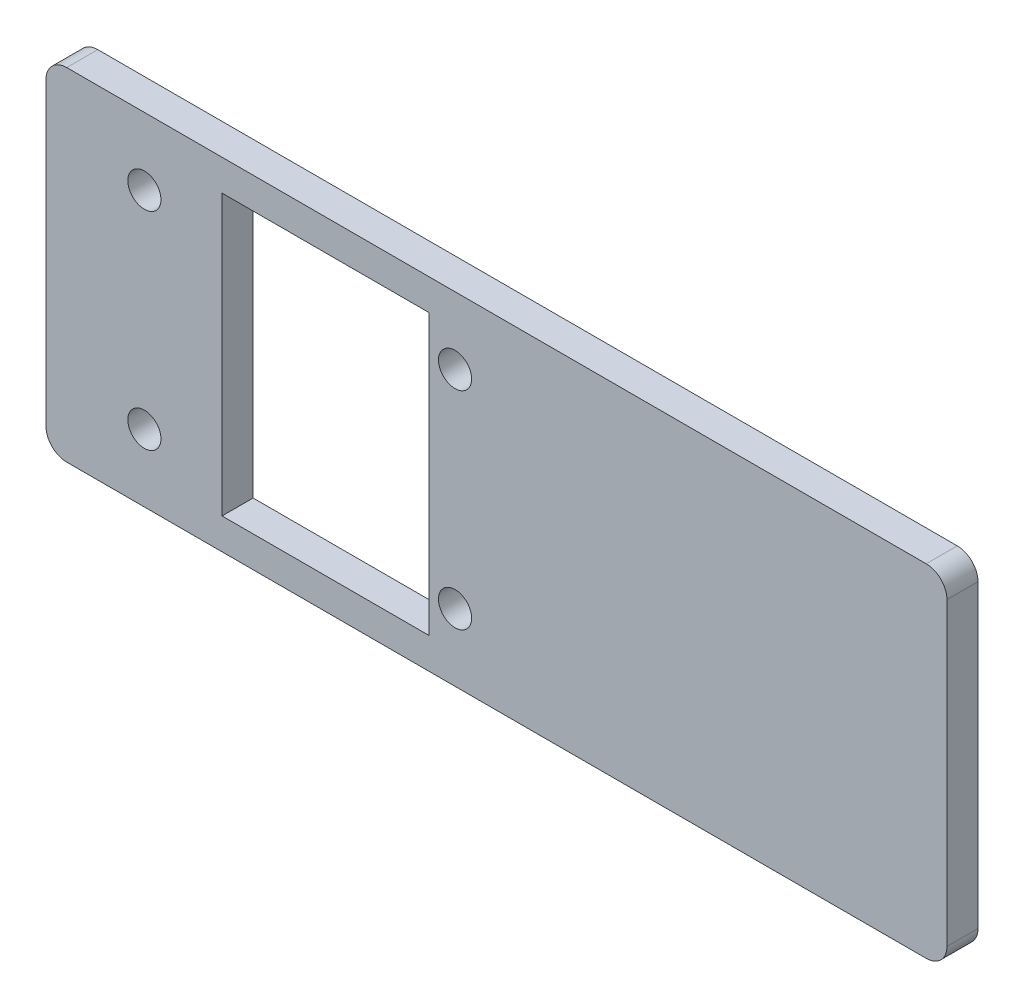
ISO-10303-21;
HEADER;
FILE_DESCRIPTION(('STEP AP214'),'2;1');
FILE_NAME('part.step','',(''),(''),'','','');
FILE_SCHEMA(('AUTOMOTIVE_DESIGN { 1 0 10303 214 1 1 1 1 }'));
ENDSEC;
DATA;
#1=APPLICATION_CONTEXT('core data for automotive mechanical design processes');
#2=APPLICATION_PROTOCOL_DEFINITION('international standard','automotive_design',2000,#1);
#3=PRODUCT_CONTEXT('',#1,'mechanical');
#4=PRODUCT('Part','Part','',(#3));
#5=PRODUCT_RELATED_PRODUCT_CATEGORY('part','',(#4));
#6=PRODUCT_DEFINITION_FORMATION('','',#4);
#7=PRODUCT_DEFINITION_CONTEXT('part definition',#1,'design');
#8=PRODUCT_DEFINITION('design','',#6,#7);
#9=PRODUCT_DEFINITION_SHAPE('','',#8);
#10=(LENGTH_UNIT() NAMED_UNIT(*) SI_UNIT(.MILLI.,.METRE.));
#11=(NAMED_UNIT(*) PLANE_ANGLE_UNIT() SI_UNIT($,.RADIAN.));
#12=(NAMED_UNIT(*) SI_UNIT($,.STERADIAN.) SOLID_ANGLE_UNIT());
#13=UNCERTAINTY_MEASURE_WITH_UNIT(LENGTH_MEASURE(1.E-05),#10,'distance_accuracy_value','');
#14=(GEOMETRIC_REPRESENTATION_CONTEXT(3) GLOBAL_UNCERTAINTY_ASSIGNED_CONTEXT((#13)) GLOBAL_UNIT_ASSIGNED_CONTEXT((#10,
#11,#12)) REPRESENTATION_CONTEXT('',''));
#15=CARTESIAN_POINT('',(0.,0.,0.));
#16=DIRECTION('',(0.,0.,1.));
#17=DIRECTION('',(1.,0.,0.));
#18=AXIS2_PLACEMENT_3D('',#15,#16,#17);
#19=CARTESIAN_POINT('',(0.,0.,3.));
#20=DIRECTION('',(0.,0.,1.));
#21=DIRECTION('',(1.,0.,0.));
#22=AXIS2_PLACEMENT_3D('',#19,#20,#21);
#23=PLANE('',#22);
#24=CARTESIAN_POINT('',(-9.6678520625889,-10.2418207681366,3.));
#25=DIRECTION('',(0.,0.,1.));
#26=DIRECTION('',(1.,0.,0.));
#27=AXIS2_PLACEMENT_3D('',#24,#25,#26);
#28=CIRCLE('',#27,1.6);
#29=CARTESIAN_POINT('',(-8.0678520625889,-10.2418207681366,3.));
#30=VERTEX_POINT('',#29);
#31=EDGE_CURVE('E154',#30,#30,#28,.T.);
#32=ORIENTED_EDGE('',*,*,#31,.F.);
#33=EDGE_LOOP('',(#32));
#34=FACE_BOUND('',#33,.T.);
#35=CARTESIAN_POINT('',(-9.6678520625889,9.75817923186344,3.));
#36=DIRECTION('',(0.,0.,1.));
#37=DIRECTION('',(1.,0.,0.));
#38=AXIS2_PLACEMENT_3D('',#35,#36,#37);
#39=CIRCLE('',#38,1.6);
#40=CARTESIAN_POINT('',(-8.0678520625889,9.75817923186344,3.));
#41=VERTEX_POINT('',#40);
#42=EDGE_CURVE('E166',#41,#41,#39,.T.);
#43=ORIENTED_EDGE('',*,*,#42,.F.);
#44=EDGE_LOOP('',(#43));
#45=FACE_BOUND('',#44,.T.);
#46=DIRECTION('',(0.,-1.,0.));
#47=VECTOR('',#46,1.);
#48=CARTESIAN_POINT('',(-19.1678520625889,16.2581792318634,3.));
#49=LINE('',#48,#47);
#50=CARTESIAN_POINT('',(-19.1678520625889,14.2581792318634,3.));
#51=VERTEX_POINT('',#50);
#52=CARTESIAN_POINT('',(-19.1678520625889,-14.7418207681366,3.));
#53=VERTEX_POINT('',#52);
#54=EDGE_CURVE('E172',#51,#53,#49,.T.);
#55=ORIENTED_EDGE('',*,*,#54,.T.);
#56=CARTESIAN_POINT('',(-17.1678520625889,-14.7418207681366,3.));
#57=DIRECTION('',(0.,0.,1.));
#58=DIRECTION('',(1.,0.,0.));
#59=AXIS2_PLACEMENT_3D('',#56,#57,#58);
#60=CIRCLE('',#59,2.);
#61=CARTESIAN_POINT('',(-17.1678520625889,-16.7418207681366,3.));
#62=VERTEX_POINT('',#61);
#63=EDGE_CURVE('E219',#53,#62,#60,.T.);
#64=ORIENTED_EDGE('',*,*,#63,.T.);
#65=DIRECTION('',(1.,0.,0.));
#66=VECTOR('',#65,1.);
#67=CARTESIAN_POINT('',(-19.1678520625889,-16.7418207681366,3.));
#68=LINE('',#67,#66);
#69=CARTESIAN_POINT('',(65.8321479374111,-16.7418207681366,3.));
#70=VERTEX_POINT('',#69);
#71=EDGE_CURVE('E175',#62,#70,#68,.T.);
#72=ORIENTED_EDGE('',*,*,#71,.T.);
#73=CARTESIAN_POINT('',(65.8321479374111,-14.7418207681366,3.));
#74=DIRECTION('',(0.,0.,1.));
#75=DIRECTION('',(1.,0.,0.));
#76=AXIS2_PLACEMENT_3D('',#73,#74,#75);
#77=CIRCLE('',#76,2.);
#78=CARTESIAN_POINT('',(67.8321479374111,-14.7418207681366,3.));
#79=VERTEX_POINT('',#78);
#80=EDGE_CURVE('E217',#70,#79,#77,.T.);
#81=ORIENTED_EDGE('',*,*,#80,.T.);
#82=DIRECTION('',(0.,1.,0.));
#83=VECTOR('',#82,1.);
#84=CARTESIAN_POINT('',(67.8321479374111,16.2581792318634,3.));
#85=LINE('',#84,#83);
#86=CARTESIAN_POINT('',(67.8321479374111,14.2581792318634,3.));
#87=VERTEX_POINT('',#86);
#88=EDGE_CURVE('E179',#79,#87,#85,.T.);
#89=ORIENTED_EDGE('',*,*,#88,.T.);
#90=CARTESIAN_POINT('',(65.8321479374111,14.2581792318634,3.));
#91=DIRECTION('',(0.,0.,1.));
#92=DIRECTION('',(1.,0.,0.));
#93=AXIS2_PLACEMENT_3D('',#90,#91,#92);
#94=CIRCLE('',#93,2.);
#95=CARTESIAN_POINT('',(65.8321479374111,16.2581792318634,3.));
#96=VERTEX_POINT('',#95);
#97=EDGE_CURVE('E215',#87,#96,#94,.T.);
#98=ORIENTED_EDGE('',*,*,#97,.T.);
#99=DIRECTION('',(-1.,0.,0.));
#100=VECTOR('',#99,1.);
#101=CARTESIAN_POINT('',(-19.1678520625889,16.2581792318634,3.));
#102=LINE('',#101,#100);
#103=CARTESIAN_POINT('',(-17.1678520625889,16.2581792318634,3.));
#104=VERTEX_POINT('',#103);
#105=EDGE_CURVE('E182',#96,#104,#102,.T.);
#106=ORIENTED_EDGE('',*,*,#105,.T.);
#107=CARTESIAN_POINT('',(-17.1678520625889,14.2581792318634,3.));
#108=DIRECTION('',(0.,0.,1.));
#109=DIRECTION('',(1.,0.,0.));
#110=AXIS2_PLACEMENT_3D('',#107,#108,#109);
#111=CIRCLE('',#110,2.);
#112=EDGE_CURVE('E213',#104,#51,#111,.T.);
#113=ORIENTED_EDGE('',*,*,#112,.T.);
#114=EDGE_LOOP('',(#55,#64,#72,#81,#89,#98,#106,#113));
#115=FACE_BOUND('',#114,.T.);
#116=CARTESIAN_POINT('',(20.3321479374111,9.75817923186344,3.));
#117=DIRECTION('',(0.,0.,1.));
#118=DIRECTION('',(1.,0.,0.));
#119=AXIS2_PLACEMENT_3D('',#116,#117,#118);
#120=CIRCLE('',#119,1.6);
#121=CARTESIAN_POINT('',(21.9321479374111,9.75817923186344,3.));
#122=VERTEX_POINT('',#121);
#123=EDGE_CURVE('E160',#122,#122,#120,.T.);
#124=ORIENTED_EDGE('',*,*,#123,.F.);
#125=EDGE_LOOP('',(#124));
#126=FACE_BOUND('',#125,.T.);
#127=CARTESIAN_POINT('',(20.3321479374111,-10.2418207681366,3.));
#128=DIRECTION('',(0.,0.,1.));
#129=DIRECTION('',(1.,0.,0.));
#130=AXIS2_PLACEMENT_3D('',#127,#128,#129);
#131=CIRCLE('',#130,1.6);
#132=CARTESIAN_POINT('',(21.9321479374111,-10.2418207681366,3.));
#133=VERTEX_POINT('',#132);
#134=EDGE_CURVE('E148',#133,#133,#131,.T.);
#135=ORIENTED_EDGE('',*,*,#134,.F.);
#136=EDGE_LOOP('',(#135));
#137=FACE_BOUND('',#136,.T.);
#138=DIRECTION('',(0.,-1.,0.));
#139=VECTOR('',#138,1.);
#140=CARTESIAN_POINT('',(17.8321479374111,13.2581792318634,3.));
#141=LINE('',#140,#139);
#142=CARTESIAN_POINT('',(17.8321479374111,13.2581792318634,3.));
#143=VERTEX_POINT('',#142);
#144=CARTESIAN_POINT('',(17.8321479374111,-13.7418207681366,3.));
#145=VERTEX_POINT('',#144);
#146=EDGE_CURVE('E139',#143,#145,#141,.T.);
#147=ORIENTED_EDGE('',*,*,#146,.T.);
#148=DIRECTION('',(-1.,0.,0.));
#149=VECTOR('',#148,1.);
#150=CARTESIAN_POINT('',(17.8321479374111,-13.7418207681366,3.));
#151=LINE('',#150,#149);
#152=CARTESIAN_POINT('',(-2.1678520625889,-13.7418207681366,3.));
#153=VERTEX_POINT('',#152);
#154=EDGE_CURVE('E48',#145,#153,#151,.T.);
#155=ORIENTED_EDGE('',*,*,#154,.T.);
#156=DIRECTION('',(0.,-1.,0.));
#157=VECTOR('',#156,1.);
#158=CARTESIAN_POINT('',(-2.1678520625889,13.2581792318634,3.));
#159=LINE('',#158,#157);
#160=CARTESIAN_POINT('',(-2.1678520625889,13.2581792318634,3.));
#161=VERTEX_POINT('',#160);
#162=EDGE_CURVE('E130',#161,#153,#159,.T.);
#163=ORIENTED_EDGE('',*,*,#162,.F.);
#164=DIRECTION('',(-1.,0.,0.));
#165=VECTOR('',#164,1.);
#166=CARTESIAN_POINT('',(17.8321479374111,13.2581792318634,3.));
#167=LINE('',#166,#165);
#168=EDGE_CURVE('E136',#143,#161,#167,.T.);
#169=ORIENTED_EDGE('',*,*,#168,.F.);
#170=EDGE_LOOP('',(#147,#155,#163,#169));
#171=FACE_BOUND('',#170,.T.);
#172=ADVANCED_FACE('F33',(#34,#45,#115,#126,#137,#171),#23,.T.);
#173=CARTESIAN_POINT('',(0.,0.,0.));
#174=DIRECTION('',(0.,0.,1.));
#175=DIRECTION('',(1.,0.,0.));
#176=AXIS2_PLACEMENT_3D('',#173,#174,#175);
#177=PLANE('',#176);
#178=CARTESIAN_POINT('',(20.3321479374111,-10.2418207681366,0.));
#179=DIRECTION('',(0.,0.,1.));
#180=DIRECTION('',(1.,0.,0.));
#181=AXIS2_PLACEMENT_3D('',#178,#179,#180);
#182=CIRCLE('',#181,1.6);
#183=CARTESIAN_POINT('',(21.9321479374111,-10.2418207681366,0.));
#184=VERTEX_POINT('',#183);
#185=EDGE_CURVE('E126',#184,#184,#182,.T.);
#186=ORIENTED_EDGE('',*,*,#185,.T.);
#187=EDGE_LOOP('',(#186));
#188=FACE_BOUND('',#187,.T.);
#189=CARTESIAN_POINT('',(-9.6678520625889,-10.2418207681366,0.));
#190=DIRECTION('',(0.,0.,1.));
#191=DIRECTION('',(1.,0.,0.));
#192=AXIS2_PLACEMENT_3D('',#189,#190,#191);
#193=CIRCLE('',#192,1.6);
#194=CARTESIAN_POINT('',(-8.0678520625889,-10.2418207681366,0.));
#195=VERTEX_POINT('',#194);
#196=EDGE_CURVE('E151',#195,#195,#193,.T.);
#197=ORIENTED_EDGE('',*,*,#196,.T.);
#198=EDGE_LOOP('',(#197));
#199=FACE_BOUND('',#198,.T.);
#200=CARTESIAN_POINT('',(20.3321479374111,9.75817923186344,0.));
#201=DIRECTION('',(0.,0.,1.));
#202=DIRECTION('',(1.,0.,0.));
#203=AXIS2_PLACEMENT_3D('',#200,#201,#202);
#204=CIRCLE('',#203,1.6);
#205=CARTESIAN_POINT('',(21.9321479374111,9.75817923186344,0.));
#206=VERTEX_POINT('',#205);
#207=EDGE_CURVE('E157',#206,#206,#204,.T.);
#208=ORIENTED_EDGE('',*,*,#207,.T.);
#209=EDGE_LOOP('',(#208));
#210=FACE_BOUND('',#209,.T.);
#211=CARTESIAN_POINT('',(-9.6678520625889,9.75817923186344,0.));
#212=DIRECTION('',(0.,0.,1.));
#213=DIRECTION('',(1.,0.,0.));
#214=AXIS2_PLACEMENT_3D('',#211,#212,#213);
#215=CIRCLE('',#214,1.6);
#216=CARTESIAN_POINT('',(-8.0678520625889,9.75817923186344,0.));
#217=VERTEX_POINT('',#216);
#218=EDGE_CURVE('E163',#217,#217,#215,.T.);
#219=ORIENTED_EDGE('',*,*,#218,.T.);
#220=EDGE_LOOP('',(#219));
#221=FACE_BOUND('',#220,.T.);
#222=DIRECTION('',(1.,0.,0.));
#223=VECTOR('',#222,1.);
#224=CARTESIAN_POINT('',(-19.1678520625889,-16.7418207681366,0.));
#225=LINE('',#224,#223);
#226=CARTESIAN_POINT('',(-17.1678520625889,-16.7418207681366,0.));
#227=VERTEX_POINT('',#226);
#228=CARTESIAN_POINT('',(65.8321479374111,-16.7418207681366,0.));
#229=VERTEX_POINT('',#228);
#230=EDGE_CURVE('E188',#227,#229,#225,.T.);
#231=ORIENTED_EDGE('',*,*,#230,.F.);
#232=CARTESIAN_POINT('',(-17.1678520625889,-14.7418207681366,0.));
#233=DIRECTION('',(0.,0.,1.));
#234=DIRECTION('',(1.,0.,0.));
#235=AXIS2_PLACEMENT_3D('',#232,#233,#234);
#236=CIRCLE('',#235,2.);
#237=CARTESIAN_POINT('',(-19.1678520625889,-14.7418207681366,0.));
#238=VERTEX_POINT('',#237);
#239=EDGE_CURVE('E206',#227,#238,#236,.F.);
#240=ORIENTED_EDGE('',*,*,#239,.T.);
#241=DIRECTION('',(0.,-1.,0.));
#242=VECTOR('',#241,1.);
#243=CARTESIAN_POINT('',(-19.1678520625889,16.2581792318634,0.));
#244=LINE('',#243,#242);
#245=CARTESIAN_POINT('',(-19.1678520625889,14.2581792318634,0.));
#246=VERTEX_POINT('',#245);
#247=EDGE_CURVE('E169',#246,#238,#244,.T.);
#248=ORIENTED_EDGE('',*,*,#247,.F.);
#249=CARTESIAN_POINT('',(-17.1678520625889,14.2581792318634,0.));
#250=DIRECTION('',(0.,0.,1.));
#251=DIRECTION('',(1.,0.,0.));
#252=AXIS2_PLACEMENT_3D('',#249,#250,#251);
#253=CIRCLE('',#252,2.);
#254=CARTESIAN_POINT('',(-17.1678520625889,16.2581792318634,0.));
#255=VERTEX_POINT('',#254);
#256=EDGE_CURVE('E200',#246,#255,#253,.F.);
#257=ORIENTED_EDGE('',*,*,#256,.T.);
#258=DIRECTION('',(-1.,0.,0.));
#259=VECTOR('',#258,1.);
#260=CARTESIAN_POINT('',(-19.1678520625889,16.2581792318634,0.));
#261=LINE('',#260,#259);
#262=CARTESIAN_POINT('',(65.8321479374111,16.2581792318634,0.));
#263=VERTEX_POINT('',#262);
#264=EDGE_CURVE('E176',#263,#255,#261,.T.);
#265=ORIENTED_EDGE('',*,*,#264,.F.);
#266=CARTESIAN_POINT('',(65.8321479374111,14.2581792318634,0.));
#267=DIRECTION('',(0.,0.,1.));
#268=DIRECTION('',(1.,0.,0.));
#269=AXIS2_PLACEMENT_3D('',#266,#267,#268);
#270=CIRCLE('',#269,2.);
#271=CARTESIAN_POINT('',(67.8321479374111,14.2581792318634,0.));
#272=VERTEX_POINT('',#271);
#273=EDGE_CURVE('E202',#263,#272,#270,.F.);
#274=ORIENTED_EDGE('',*,*,#273,.T.);
#275=DIRECTION('',(0.,1.,0.));
#276=VECTOR('',#275,1.);
#277=CARTESIAN_POINT('',(67.8321479374111,16.2581792318634,0.));
#278=LINE('',#277,#276);
#279=CARTESIAN_POINT('',(67.8321479374111,-14.7418207681366,0.));
#280=VERTEX_POINT('',#279);
#281=EDGE_CURVE('E191',#280,#272,#278,.T.);
#282=ORIENTED_EDGE('',*,*,#281,.F.);
#283=CARTESIAN_POINT('',(65.8321479374111,-14.7418207681366,0.));
#284=DIRECTION('',(0.,0.,1.));
#285=DIRECTION('',(1.,0.,0.));
#286=AXIS2_PLACEMENT_3D('',#283,#284,#285);
#287=CIRCLE('',#286,2.);
#288=EDGE_CURVE('E204',#280,#229,#287,.F.);
#289=ORIENTED_EDGE('',*,*,#288,.T.);
#290=EDGE_LOOP('',(#231,#240,#248,#257,#265,#274,#282,#289));
#291=FACE_BOUND('',#290,.T.);
#292=DIRECTION('',(-1.,0.,0.));
#293=VECTOR('',#292,1.);
#294=CARTESIAN_POINT('',(0.,-13.7418207681366,0.));
#295=LINE('',#294,#293);
#296=CARTESIAN_POINT('',(17.8321479374111,-13.7418207681366,0.));
#297=VERTEX_POINT('',#296);
#298=CARTESIAN_POINT('',(-2.1678520625889,-13.7418207681366,0.));
#299=VERTEX_POINT('',#298);
#300=EDGE_CURVE('E11',#297,#299,#295,.T.);
#301=ORIENTED_EDGE('',*,*,#300,.F.);
#302=DIRECTION('',(0.,-1.,0.));
#303=VECTOR('',#302,1.);
#304=CARTESIAN_POINT('',(17.8321479374111,0.,0.));
#305=LINE('',#304,#303);
#306=CARTESIAN_POINT('',(17.8321479374111,13.2581792318634,0.));
#307=VERTEX_POINT('',#306);
#308=EDGE_CURVE('E231',#307,#297,#305,.T.);
#309=ORIENTED_EDGE('',*,*,#308,.F.);
#310=DIRECTION('',(-1.,0.,0.));
#311=VECTOR('',#310,1.);
#312=CARTESIAN_POINT('',(0.,13.2581792318634,0.));
#313=LINE('',#312,#311);
#314=CARTESIAN_POINT('',(-2.1678520625889,13.2581792318634,0.));
#315=VERTEX_POINT('',#314);
#316=EDGE_CURVE('E233',#307,#315,#313,.T.);
#317=ORIENTED_EDGE('',*,*,#316,.T.);
#318=DIRECTION('',(0.,-1.,0.));
#319=VECTOR('',#318,1.);
#320=CARTESIAN_POINT('',(-2.1678520625889,0.,0.));
#321=LINE('',#320,#319);
#322=EDGE_CURVE('E41',#315,#299,#321,.T.);
#323=ORIENTED_EDGE('',*,*,#322,.T.);
#324=EDGE_LOOP('',(#301,#309,#317,#323));
#325=FACE_BOUND('',#324,.T.);
#326=ADVANCED_FACE('F236',(#188,#199,#210,#221,#291,#325),#177,.F.);
#327=CARTESIAN_POINT('',(-19.1678520625889,16.2581792318634,3.));
#328=DIRECTION('',(1.,0.,0.));
#329=DIRECTION('',(0.,0.,-1.));
#330=AXIS2_PLACEMENT_3D('',#327,#328,#329);
#331=PLANE('',#330);
#332=ORIENTED_EDGE('',*,*,#247,.T.);
#333=DIRECTION('',(0.,0.,-1.));
#334=VECTOR('',#333,1.);
#335=CARTESIAN_POINT('',(-19.1678520625889,-14.7418207681366,3.));
#336=LINE('',#335,#334);
#337=EDGE_CURVE('E211',#238,#53,#336,.F.);
#338=ORIENTED_EDGE('',*,*,#337,.T.);
#339=ORIENTED_EDGE('',*,*,#54,.F.);
#340=DIRECTION('',(0.,0.,-1.));
#341=VECTOR('',#340,1.);
#342=CARTESIAN_POINT('',(-19.1678520625889,14.2581792318634,3.));
#343=LINE('',#342,#341);
#344=EDGE_CURVE('E208',#51,#246,#343,.T.);
#345=ORIENTED_EDGE('',*,*,#344,.T.);
#346=EDGE_LOOP('',(#332,#338,#339,#345));
#347=FACE_BOUND('',#346,.T.);
#348=ADVANCED_FACE('F253',(#347),#331,.F.);
#349=CARTESIAN_POINT('',(-19.1678520625889,-16.7418207681366,3.));
#350=DIRECTION('',(0.,1.,0.));
#351=DIRECTION('',(0.,0.,1.));
#352=AXIS2_PLACEMENT_3D('',#349,#350,#351);
#353=PLANE('',#352);
#354=ORIENTED_EDGE('',*,*,#71,.F.);
#355=DIRECTION('',(0.,0.,-1.));
#356=VECTOR('',#355,1.);
#357=CARTESIAN_POINT('',(-17.1678520625889,-16.7418207681366,3.));
#358=LINE('',#357,#356);
#359=EDGE_CURVE('E197',#62,#227,#358,.T.);
#360=ORIENTED_EDGE('',*,*,#359,.T.);
#361=ORIENTED_EDGE('',*,*,#230,.T.);
#362=DIRECTION('',(0.,0.,-1.));
#363=VECTOR('',#362,1.);
#364=CARTESIAN_POINT('',(65.8321479374111,-16.7418207681366,3.));
#365=LINE('',#364,#363);
#366=EDGE_CURVE('E185',#229,#70,#365,.F.);
#367=ORIENTED_EDGE('',*,*,#366,.T.);
#368=EDGE_LOOP('',(#354,#360,#361,#367));
#369=FACE_BOUND('',#368,.T.);
#370=ADVANCED_FACE('F269',(#369),#353,.F.);
#371=CARTESIAN_POINT('',(67.8321479374111,16.2581792318634,3.));
#372=DIRECTION('',(-1.,0.,0.));
#373=DIRECTION('',(0.,0.,1.));
#374=AXIS2_PLACEMENT_3D('',#371,#372,#373);
#375=PLANE('',#374);
#376=ORIENTED_EDGE('',*,*,#88,.F.);
#377=DIRECTION('',(0.,0.,-1.));
#378=VECTOR('',#377,1.);
#379=CARTESIAN_POINT('',(67.8321479374111,-14.7418207681366,3.));
#380=LINE('',#379,#378);
#381=EDGE_CURVE('E223',#79,#280,#380,.T.);
#382=ORIENTED_EDGE('',*,*,#381,.T.);
#383=ORIENTED_EDGE('',*,*,#281,.T.);
#384=DIRECTION('',(0.,0.,-1.));
#385=VECTOR('',#384,1.);
#386=CARTESIAN_POINT('',(67.8321479374111,14.2581792318634,3.));
#387=LINE('',#386,#385);
#388=EDGE_CURVE('E221',#272,#87,#387,.F.);
#389=ORIENTED_EDGE('',*,*,#388,.T.);
#390=EDGE_LOOP('',(#376,#382,#383,#389));
#391=FACE_BOUND('',#390,.T.);
#392=ADVANCED_FACE('F265',(#391),#375,.F.);
#393=CARTESIAN_POINT('',(-19.1678520625889,16.2581792318634,3.));
#394=DIRECTION('',(0.,-1.,0.));
#395=DIRECTION('',(0.,0.,-1.));
#396=AXIS2_PLACEMENT_3D('',#393,#394,#395);
#397=PLANE('',#396);
#398=ORIENTED_EDGE('',*,*,#105,.F.);
#399=DIRECTION('',(0.,0.,-1.));
#400=VECTOR('',#399,1.);
#401=CARTESIAN_POINT('',(65.8321479374111,16.2581792318634,3.));
#402=LINE('',#401,#400);
#403=EDGE_CURVE('E228',#96,#263,#402,.T.);
#404=ORIENTED_EDGE('',*,*,#403,.T.);
#405=ORIENTED_EDGE('',*,*,#264,.T.);
#406=DIRECTION('',(0.,0.,-1.));
#407=VECTOR('',#406,1.);
#408=CARTESIAN_POINT('',(-17.1678520625889,16.2581792318634,3.));
#409=LINE('',#408,#407);
#410=EDGE_CURVE('E226',#255,#104,#409,.F.);
#411=ORIENTED_EDGE('',*,*,#410,.T.);
#412=EDGE_LOOP('',(#398,#404,#405,#411));
#413=FACE_BOUND('',#412,.T.);
#414=ADVANCED_FACE('F262',(#413),#397,.F.);
#415=CARTESIAN_POINT('',(-9.6678520625889,9.75817923186344,3.));
#416=DIRECTION('',(0.,0.,-1.));
#417=DIRECTION('',(-1.,0.,0.));
#418=AXIS2_PLACEMENT_3D('',#415,#416,#417);
#419=CYLINDRICAL_SURFACE('',#418,1.6);
#420=ORIENTED_EDGE('',*,*,#42,.T.);
#421=EDGE_LOOP('',(#420));
#422=FACE_BOUND('',#421,.T.);
#423=ORIENTED_EDGE('',*,*,#218,.F.);
#424=EDGE_LOOP('',(#423));
#425=FACE_BOUND('',#424,.T.);
#426=ADVANCED_FACE('F259',(#422,#425),#419,.F.);
#427=CARTESIAN_POINT('',(20.3321479374111,9.75817923186344,3.));
#428=DIRECTION('',(0.,0.,-1.));
#429=DIRECTION('',(-1.,0.,0.));
#430=AXIS2_PLACEMENT_3D('',#427,#428,#429);
#431=CYLINDRICAL_SURFACE('',#430,1.6);
#432=ORIENTED_EDGE('',*,*,#123,.T.);
#433=EDGE_LOOP('',(#432));
#434=FACE_BOUND('',#433,.T.);
#435=ORIENTED_EDGE('',*,*,#207,.F.);
#436=EDGE_LOOP('',(#435));
#437=FACE_BOUND('',#436,.T.);
#438=ADVANCED_FACE('F332',(#434,#437),#431,.F.);
#439=CARTESIAN_POINT('',(-9.6678520625889,-10.2418207681366,3.));
#440=DIRECTION('',(0.,0.,-1.));
#441=DIRECTION('',(-1.,0.,0.));
#442=AXIS2_PLACEMENT_3D('',#439,#440,#441);
#443=CYLINDRICAL_SURFACE('',#442,1.6);
#444=ORIENTED_EDGE('',*,*,#31,.T.);
#445=EDGE_LOOP('',(#444));
#446=FACE_BOUND('',#445,.T.);
#447=ORIENTED_EDGE('',*,*,#196,.F.);
#448=EDGE_LOOP('',(#447));
#449=FACE_BOUND('',#448,.T.);
#450=ADVANCED_FACE('F321',(#446,#449),#443,.F.);
#451=CARTESIAN_POINT('',(20.3321479374111,-10.2418207681366,3.));
#452=DIRECTION('',(0.,0.,-1.));
#453=DIRECTION('',(-1.,0.,0.));
#454=AXIS2_PLACEMENT_3D('',#451,#452,#453);
#455=CYLINDRICAL_SURFACE('',#454,1.6);
#456=ORIENTED_EDGE('',*,*,#134,.T.);
#457=EDGE_LOOP('',(#456));
#458=FACE_BOUND('',#457,.T.);
#459=ORIENTED_EDGE('',*,*,#185,.F.);
#460=EDGE_LOOP('',(#459));
#461=FACE_BOUND('',#460,.T.);
#462=ADVANCED_FACE('F281',(#458,#461),#455,.F.);
#463=CARTESIAN_POINT('',(-17.1678520625889,-14.7418207681366,3.));
#464=DIRECTION('',(0.,0.,-1.));
#465=DIRECTION('',(-1.,0.,0.));
#466=AXIS2_PLACEMENT_3D('',#463,#464,#465);
#467=CYLINDRICAL_SURFACE('',#466,2.);
#468=ORIENTED_EDGE('',*,*,#63,.F.);
#469=ORIENTED_EDGE('',*,*,#337,.F.);
#470=ORIENTED_EDGE('',*,*,#239,.F.);
#471=ORIENTED_EDGE('',*,*,#359,.F.);
#472=EDGE_LOOP('',(#468,#469,#470,#471));
#473=FACE_BOUND('',#472,.T.);
#474=ADVANCED_FACE('F277',(#473),#467,.T.);
#475=CARTESIAN_POINT('',(65.8321479374111,-14.7418207681366,3.));
#476=DIRECTION('',(0.,0.,-1.));
#477=DIRECTION('',(-1.,0.,0.));
#478=AXIS2_PLACEMENT_3D('',#475,#476,#477);
#479=CYLINDRICAL_SURFACE('',#478,2.);
#480=ORIENTED_EDGE('',*,*,#80,.F.);
#481=ORIENTED_EDGE('',*,*,#366,.F.);
#482=ORIENTED_EDGE('',*,*,#288,.F.);
#483=ORIENTED_EDGE('',*,*,#381,.F.);
#484=EDGE_LOOP('',(#480,#481,#482,#483));
#485=FACE_BOUND('',#484,.T.);
#486=ADVANCED_FACE('F280',(#485),#479,.T.);
#487=CARTESIAN_POINT('',(65.8321479374111,14.2581792318634,3.));
#488=DIRECTION('',(0.,0.,-1.));
#489=DIRECTION('',(-1.,0.,0.));
#490=AXIS2_PLACEMENT_3D('',#487,#488,#489);
#491=CYLINDRICAL_SURFACE('',#490,2.);
#492=ORIENTED_EDGE('',*,*,#97,.F.);
#493=ORIENTED_EDGE('',*,*,#388,.F.);
#494=ORIENTED_EDGE('',*,*,#273,.F.);
#495=ORIENTED_EDGE('',*,*,#403,.F.);
#496=EDGE_LOOP('',(#492,#493,#494,#495));
#497=FACE_BOUND('',#496,.T.);
#498=ADVANCED_FACE('F284',(#497),#491,.T.);
#499=CARTESIAN_POINT('',(-17.1678520625889,14.2581792318634,3.));
#500=DIRECTION('',(0.,0.,-1.));
#501=DIRECTION('',(-1.,0.,0.));
#502=AXIS2_PLACEMENT_3D('',#499,#500,#501);
#503=CYLINDRICAL_SURFACE('',#502,2.);
#504=ORIENTED_EDGE('',*,*,#112,.F.);
#505=ORIENTED_EDGE('',*,*,#410,.F.);
#506=ORIENTED_EDGE('',*,*,#256,.F.);
#507=ORIENTED_EDGE('',*,*,#344,.F.);
#508=EDGE_LOOP('',(#504,#505,#506,#507));
#509=FACE_BOUND('',#508,.T.);
#510=ADVANCED_FACE('F35',(#509),#503,.T.);
#511=CARTESIAN_POINT('',(17.8321479374111,-13.7418207681366,-7.));
#512=DIRECTION('',(0.,1.,0.));
#513=DIRECTION('',(-1.,0.,0.));
#514=AXIS2_PLACEMENT_3D('',#511,#512,#513);
#515=PLANE('',#514);
#516=ORIENTED_EDGE('',*,*,#300,.T.);
#517=DIRECTION('',(0.,0.,1.));
#518=VECTOR('',#517,1.);
#519=CARTESIAN_POINT('',(-2.1678520625889,-13.7418207681366,-7.));
#520=LINE('',#519,#518);
#521=EDGE_CURVE('E120',#299,#153,#520,.T.);
#522=ORIENTED_EDGE('',*,*,#521,.T.);
#523=ORIENTED_EDGE('',*,*,#154,.F.);
#524=DIRECTION('',(0.,0.,1.));
#525=VECTOR('',#524,1.);
#526=CARTESIAN_POINT('',(17.8321479374111,-13.7418207681366,-7.));
#527=LINE('',#526,#525);
#528=EDGE_CURVE('E144',#297,#145,#527,.T.);
#529=ORIENTED_EDGE('',*,*,#528,.F.);
#530=EDGE_LOOP('',(#516,#522,#523,#529));
#531=FACE_BOUND('',#530,.T.);
#532=ADVANCED_FACE('F122',(#531),#515,.T.);
#533=CARTESIAN_POINT('',(-2.1678520625889,13.2581792318634,-7.));
#534=DIRECTION('',(-1.,0.,0.));
#535=DIRECTION('',(0.,0.,1.));
#536=AXIS2_PLACEMENT_3D('',#533,#534,#535);
#537=PLANE('',#536);
#538=DIRECTION('',(0.,0.,1.));
#539=VECTOR('',#538,1.);
#540=CARTESIAN_POINT('',(-2.1678520625889,13.2581792318634,-7.));
#541=LINE('',#540,#539);
#542=EDGE_CURVE('E127',#315,#161,#541,.T.);
#543=ORIENTED_EDGE('',*,*,#542,.T.);
#544=ORIENTED_EDGE('',*,*,#162,.T.);
#545=ORIENTED_EDGE('',*,*,#521,.F.);
#546=ORIENTED_EDGE('',*,*,#322,.F.);
#547=EDGE_LOOP('',(#543,#544,#545,#546));
#548=FACE_BOUND('',#547,.T.);
#549=ADVANCED_FACE('F131',(#548),#537,.F.);
#550=CARTESIAN_POINT('',(17.8321479374111,13.2581792318634,-7.));
#551=DIRECTION('',(0.,1.,0.));
#552=DIRECTION('',(-1.,0.,0.));
#553=AXIS2_PLACEMENT_3D('',#550,#551,#552);
#554=PLANE('',#553);
#555=DIRECTION('',(0.,0.,1.));
#556=VECTOR('',#555,1.);
#557=CARTESIAN_POINT('',(17.8321479374111,13.2581792318634,-7.));
#558=LINE('',#557,#556);
#559=EDGE_CURVE('E56',#307,#143,#558,.T.);
#560=ORIENTED_EDGE('',*,*,#559,.T.);
#561=ORIENTED_EDGE('',*,*,#168,.T.);
#562=ORIENTED_EDGE('',*,*,#542,.F.);
#563=ORIENTED_EDGE('',*,*,#316,.F.);
#564=EDGE_LOOP('',(#560,#561,#562,#563));
#565=FACE_BOUND('',#564,.T.);
#566=ADVANCED_FACE('F239',(#565),#554,.F.);
#567=CARTESIAN_POINT('',(17.8321479374111,13.2581792318634,-7.));
#568=DIRECTION('',(-1.,0.,0.));
#569=DIRECTION('',(0.,0.,1.));
#570=AXIS2_PLACEMENT_3D('',#567,#568,#569);
#571=PLANE('',#570);
#572=ORIENTED_EDGE('',*,*,#308,.T.);
#573=ORIENTED_EDGE('',*,*,#528,.T.);
#574=ORIENTED_EDGE('',*,*,#146,.F.);
#575=ORIENTED_EDGE('',*,*,#559,.F.);
#576=EDGE_LOOP('',(#572,#573,#574,#575));
#577=FACE_BOUND('',#576,.T.);
#578=ADVANCED_FACE('F240',(#577),#571,.T.);
#579=CLOSED_SHELL('',(#172,#326,#348,#370,#392,#414,#426,#438,#450,#462,#474,#486,#498,#510,
#532,#549,#566,#578));
#580=MANIFOLD_SOLID_BREP('B2',#579);
#581=ADVANCED_BREP_SHAPE_REPRESENTATION('',(#18,#580),#14);
#582=SHAPE_DEFINITION_REPRESENTATION(#9,#581);
ENDSEC;
END-ISO-10303-21;
